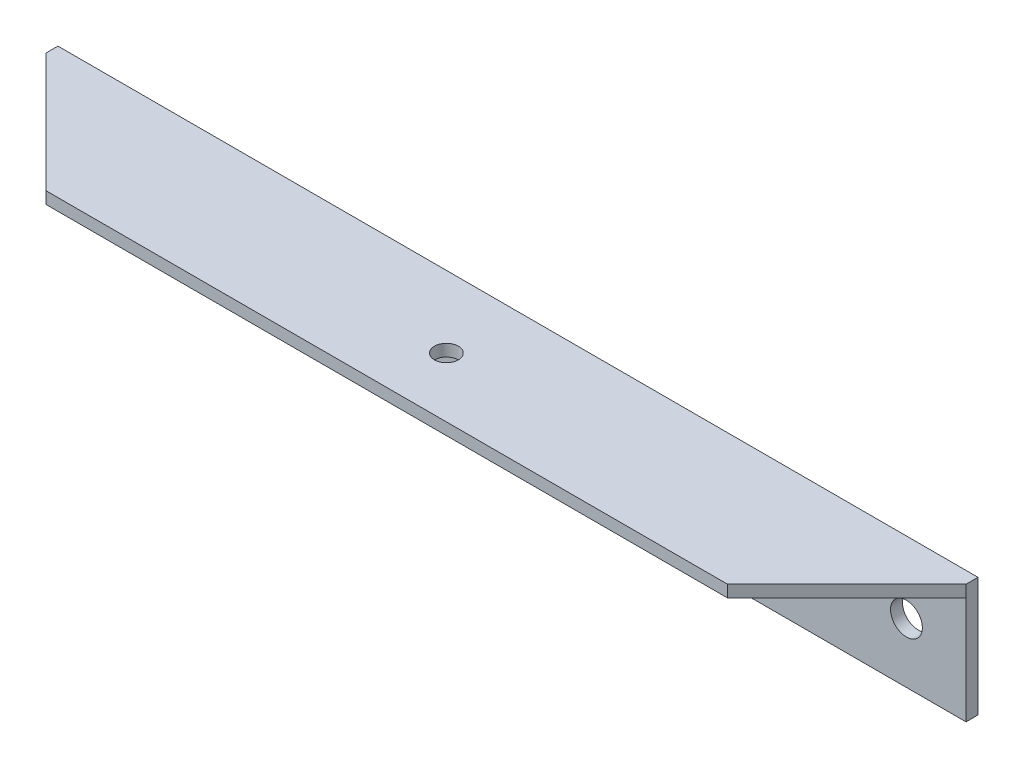
ISO-10303-21;
HEADER;
FILE_DESCRIPTION(('STEP AP214'),'2;1');
FILE_NAME('part.step','',(''),(''),'','','');
FILE_SCHEMA(('AUTOMOTIVE_DESIGN { 1 0 10303 214 1 1 1 1 }'));
ENDSEC;
DATA;
#1=APPLICATION_CONTEXT('core data for automotive mechanical design processes');
#2=APPLICATION_PROTOCOL_DEFINITION('international standard','automotive_design',2000,#1);
#3=PRODUCT_CONTEXT('',#1,'mechanical');
#4=PRODUCT('Part','Part','',(#3));
#5=PRODUCT_RELATED_PRODUCT_CATEGORY('part','',(#4));
#6=PRODUCT_DEFINITION_FORMATION('','',#4);
#7=PRODUCT_DEFINITION_CONTEXT('part definition',#1,'design');
#8=PRODUCT_DEFINITION('design','',#6,#7);
#9=PRODUCT_DEFINITION_SHAPE('','',#8);
#10=(LENGTH_UNIT() NAMED_UNIT(*) SI_UNIT(.MILLI.,.METRE.));
#11=(NAMED_UNIT(*) PLANE_ANGLE_UNIT() SI_UNIT($,.RADIAN.));
#12=(NAMED_UNIT(*) SI_UNIT($,.STERADIAN.) SOLID_ANGLE_UNIT());
#13=UNCERTAINTY_MEASURE_WITH_UNIT(LENGTH_MEASURE(1.E-05),#10,'distance_accuracy_value','');
#14=(GEOMETRIC_REPRESENTATION_CONTEXT(3) GLOBAL_UNCERTAINTY_ASSIGNED_CONTEXT((#13)) GLOBAL_UNIT_ASSIGNED_CONTEXT((#10,
#11,#12)) REPRESENTATION_CONTEXT('',''));
#15=CARTESIAN_POINT('',(0.,0.,0.));
#16=DIRECTION('',(0.,0.,1.));
#17=DIRECTION('',(1.,0.,0.));
#18=AXIS2_PLACEMENT_3D('',#15,#16,#17);
#19=CARTESIAN_POINT('',(115.7,0.,3.));
#20=DIRECTION('',(-1.,0.,0.));
#21=DIRECTION('',(0.,0.,1.));
#22=AXIS2_PLACEMENT_3D('',#19,#20,#21);
#23=PLANE('',#22);
#24=DIRECTION('',(0.,1.,0.));
#25=VECTOR('',#24,1.);
#26=CARTESIAN_POINT('',(115.7,0.,0.));
#27=LINE('',#26,#25);
#28=CARTESIAN_POINT('',(115.7,-30.,0.));
#29=VERTEX_POINT('',#28);
#30=CARTESIAN_POINT('',(115.7,0.,0.));
#31=VERTEX_POINT('',#30);
#32=EDGE_CURVE('E94',#29,#31,#27,.T.);
#33=ORIENTED_EDGE('',*,*,#32,.T.);
#34=DIRECTION('',(0.,0.,-1.));
#35=VECTOR('',#34,1.);
#36=CARTESIAN_POINT('',(115.7,0.,3.));
#37=LINE('',#36,#35);
#38=CARTESIAN_POINT('',(115.7,0.,3.));
#39=VERTEX_POINT('',#38);
#40=EDGE_CURVE('E11',#39,#31,#37,.T.);
#41=ORIENTED_EDGE('',*,*,#40,.F.);
#42=DIRECTION('',(0.,1.,0.));
#43=VECTOR('',#42,1.);
#44=CARTESIAN_POINT('',(115.7,-2.99999999999998,3.));
#45=LINE('',#44,#43);
#46=CARTESIAN_POINT('',(115.7,-2.99999999999998,3.));
#47=VERTEX_POINT('',#46);
#48=EDGE_CURVE('E99',#47,#39,#45,.T.);
#49=ORIENTED_EDGE('',*,*,#48,.F.);
#50=DIRECTION('',(0.,1.,0.));
#51=VECTOR('',#50,1.);
#52=CARTESIAN_POINT('',(115.7,0.,3.));
#53=LINE('',#52,#51);
#54=CARTESIAN_POINT('',(115.7,-30.,3.));
#55=VERTEX_POINT('',#54);
#56=EDGE_CURVE('E88',#55,#47,#53,.T.);
#57=ORIENTED_EDGE('',*,*,#56,.F.);
#58=DIRECTION('',(0.,0.,-1.));
#59=VECTOR('',#58,1.);
#60=CARTESIAN_POINT('',(115.7,-30.,3.));
#61=LINE('',#60,#59);
#62=EDGE_CURVE('E81',#55,#29,#61,.T.);
#63=ORIENTED_EDGE('',*,*,#62,.T.);
#64=EDGE_LOOP('',(#33,#41,#49,#57,#63));
#65=FACE_BOUND('',#64,.T.);
#66=ADVANCED_FACE('F35',(#65),#23,.F.);
#67=CARTESIAN_POINT('',(-115.7,0.,3.));
#68=DIRECTION('',(0.,-1.,0.));
#69=DIRECTION('',(1.,0.,0.));
#70=AXIS2_PLACEMENT_3D('',#67,#68,#69);
#71=PLANE('',#70);
#72=CARTESIAN_POINT('',(0.,0.,17.9999999999998));
#73=DIRECTION('',(0.,1.,0.));
#74=DIRECTION('',(0.,0.,1.));
#75=AXIS2_PLACEMENT_3D('',#72,#73,#74);
#76=CIRCLE('',#75,3.);
#77=CARTESIAN_POINT('',(0.,0.,20.9999999999998));
#78=VERTEX_POINT('',#77);
#79=EDGE_CURVE('E199',#78,#78,#76,.T.);
#80=ORIENTED_EDGE('',*,*,#79,.F.);
#81=EDGE_LOOP('',(#80));
#82=FACE_BOUND('',#81,.T.);
#83=DIRECTION('',(-1.,0.,0.));
#84=VECTOR('',#83,1.);
#85=CARTESIAN_POINT('',(-115.7,0.,0.));
#86=LINE('',#85,#84);
#87=CARTESIAN_POINT('',(-115.7,0.,0.));
#88=VERTEX_POINT('',#87);
#89=EDGE_CURVE('E98',#31,#88,#86,.T.);
#90=ORIENTED_EDGE('',*,*,#89,.T.);
#91=DIRECTION('',(0.,0.,-1.));
#92=VECTOR('',#91,1.);
#93=CARTESIAN_POINT('',(-115.7,0.,3.));
#94=LINE('',#93,#92);
#95=CARTESIAN_POINT('',(-115.7,0.,3.));
#96=VERTEX_POINT('',#95);
#97=EDGE_CURVE('E43',#96,#88,#94,.T.);
#98=ORIENTED_EDGE('',*,*,#97,.F.);
#99=DIRECTION('',(0.707106781186549,0.,0.707106781186546));
#100=VECTOR('',#99,1.);
#101=CARTESIAN_POINT('',(-115.7,0.,3.));
#102=LINE('',#101,#100);
#103=CARTESIAN_POINT('',(-85.7000000000001,0.,32.9999999999998));
#104=VERTEX_POINT('',#103);
#105=EDGE_CURVE('E124',#96,#104,#102,.T.);
#106=ORIENTED_EDGE('',*,*,#105,.T.);
#107=DIRECTION('',(1.,0.,0.));
#108=VECTOR('',#107,1.);
#109=CARTESIAN_POINT('',(-85.7000000000001,0.,32.9999999999998));
#110=LINE('',#109,#108);
#111=CARTESIAN_POINT('',(85.6999999999998,0.,32.9999999999998));
#112=VERTEX_POINT('',#111);
#113=EDGE_CURVE('E165',#104,#112,#110,.T.);
#114=ORIENTED_EDGE('',*,*,#113,.T.);
#115=DIRECTION('',(0.707106781186552,0.,-0.707106781186543));
#116=VECTOR('',#115,1.);
#117=CARTESIAN_POINT('',(115.7,0.,3.));
#118=LINE('',#117,#116);
#119=EDGE_CURVE('E147',#112,#39,#118,.T.);
#120=ORIENTED_EDGE('',*,*,#119,.T.);
#121=ORIENTED_EDGE('',*,*,#40,.T.);
#122=EDGE_LOOP('',(#90,#98,#106,#114,#120,#121));
#123=FACE_BOUND('',#122,.T.);
#124=ADVANCED_FACE('F120',(#82,#123),#71,.F.);
#125=CARTESIAN_POINT('',(-115.7,-30.,3.));
#126=DIRECTION('',(1.,0.,0.));
#127=DIRECTION('',(0.,0.,-1.));
#128=AXIS2_PLACEMENT_3D('',#125,#126,#127);
#129=PLANE('',#128);
#130=DIRECTION('',(0.,-1.,0.));
#131=VECTOR('',#130,1.);
#132=CARTESIAN_POINT('',(-115.7,-30.,0.));
#133=LINE('',#132,#131);
#134=CARTESIAN_POINT('',(-115.7,-30.,0.));
#135=VERTEX_POINT('',#134);
#136=EDGE_CURVE('E89',#88,#135,#133,.T.);
#137=ORIENTED_EDGE('',*,*,#136,.T.);
#138=DIRECTION('',(0.,0.,-1.));
#139=VECTOR('',#138,1.);
#140=CARTESIAN_POINT('',(-115.7,-30.,3.));
#141=LINE('',#140,#139);
#142=CARTESIAN_POINT('',(-115.7,-30.,3.));
#143=VERTEX_POINT('',#142);
#144=EDGE_CURVE('E84',#143,#135,#141,.T.);
#145=ORIENTED_EDGE('',*,*,#144,.F.);
#146=DIRECTION('',(0.,-1.,0.));
#147=VECTOR('',#146,1.);
#148=CARTESIAN_POINT('',(-115.7,-30.,3.));
#149=LINE('',#148,#147);
#150=CARTESIAN_POINT('',(-115.7,-3.00000000000001,3.));
#151=VERTEX_POINT('',#150);
#152=EDGE_CURVE('E169',#151,#143,#149,.T.);
#153=ORIENTED_EDGE('',*,*,#152,.F.);
#154=EDGE_CURVE('E117',#96,#151,#149,.T.);
#155=ORIENTED_EDGE('',*,*,#154,.F.);
#156=ORIENTED_EDGE('',*,*,#97,.T.);
#157=EDGE_LOOP('',(#137,#145,#153,#155,#156));
#158=FACE_BOUND('',#157,.T.);
#159=ADVANCED_FACE('F114',(#158),#129,.F.);
#160=CARTESIAN_POINT('',(115.7,-30.,3.));
#161=DIRECTION('',(0.,1.,0.));
#162=DIRECTION('',(0.,0.,1.));
#163=AXIS2_PLACEMENT_3D('',#160,#161,#162);
#164=PLANE('',#163);
#165=DIRECTION('',(1.,0.,0.));
#166=VECTOR('',#165,1.);
#167=CARTESIAN_POINT('',(115.7,-30.,0.));
#168=LINE('',#167,#166);
#169=EDGE_CURVE('E78',#135,#29,#168,.T.);
#170=ORIENTED_EDGE('',*,*,#169,.T.);
#171=ORIENTED_EDGE('',*,*,#62,.F.);
#172=DIRECTION('',(1.,0.,0.));
#173=VECTOR('',#172,1.);
#174=CARTESIAN_POINT('',(115.7,-30.,3.));
#175=LINE('',#174,#173);
#176=EDGE_CURVE('E59',#143,#55,#175,.T.);
#177=ORIENTED_EDGE('',*,*,#176,.F.);
#178=ORIENTED_EDGE('',*,*,#144,.T.);
#179=EDGE_LOOP('',(#170,#171,#177,#178));
#180=FACE_BOUND('',#179,.T.);
#181=ADVANCED_FACE('F80',(#180),#164,.F.);
#182=CARTESIAN_POINT('',(0.,0.,3.));
#183=DIRECTION('',(0.,0.,-1.));
#184=DIRECTION('',(-1.,0.,0.));
#185=AXIS2_PLACEMENT_3D('',#182,#183,#184);
#186=PLANE('',#185);
#187=CARTESIAN_POINT('',(-62.5,-15.,3.));
#188=DIRECTION('',(0.,0.,-1.));
#189=DIRECTION('',(-1.,0.,0.));
#190=AXIS2_PLACEMENT_3D('',#187,#188,#189);
#191=CIRCLE('',#190,4.99999999999999);
#192=CARTESIAN_POINT('',(-67.5,-15.,3.));
#193=VERTEX_POINT('',#192);
#194=EDGE_CURVE('E209',#193,#193,#191,.T.);
#195=ORIENTED_EDGE('',*,*,#194,.T.);
#196=EDGE_LOOP('',(#195));
#197=FACE_BOUND('',#196,.T.);
#198=CARTESIAN_POINT('',(100.7,-15.,3.));
#199=DIRECTION('',(0.,0.,-1.));
#200=DIRECTION('',(-1.,0.,0.));
#201=AXIS2_PLACEMENT_3D('',#198,#199,#200);
#202=CIRCLE('',#201,3.99999999999999);
#203=CARTESIAN_POINT('',(96.7,-15.,3.));
#204=VERTEX_POINT('',#203);
#205=EDGE_CURVE('E214',#204,#204,#202,.T.);
#206=ORIENTED_EDGE('',*,*,#205,.T.);
#207=EDGE_LOOP('',(#206));
#208=FACE_BOUND('',#207,.T.);
#209=CARTESIAN_POINT('',(-100.7,-15.,3.));
#210=DIRECTION('',(0.,0.,-1.));
#211=DIRECTION('',(-1.,0.,0.));
#212=AXIS2_PLACEMENT_3D('',#209,#210,#211);
#213=CIRCLE('',#212,3.99999999999999);
#214=CARTESIAN_POINT('',(-104.7,-15.,3.));
#215=VERTEX_POINT('',#214);
#216=EDGE_CURVE('E38',#215,#215,#213,.T.);
#217=ORIENTED_EDGE('',*,*,#216,.T.);
#218=EDGE_LOOP('',(#217));
#219=FACE_BOUND('',#218,.T.);
#220=ORIENTED_EDGE('',*,*,#56,.T.);
#221=DIRECTION('',(-1.,0.,0.));
#222=VECTOR('',#221,1.);
#223=CARTESIAN_POINT('',(-115.7,-3.00000000000002,3.));
#224=LINE('',#223,#222);
#225=EDGE_CURVE('E156',#47,#151,#224,.T.);
#226=ORIENTED_EDGE('',*,*,#225,.T.);
#227=ORIENTED_EDGE('',*,*,#152,.T.);
#228=ORIENTED_EDGE('',*,*,#176,.T.);
#229=EDGE_LOOP('',(#220,#226,#227,#228));
#230=FACE_BOUND('',#229,.T.);
#231=ADVANCED_FACE('F170',(#197,#208,#219,#230),#186,.F.);
#232=CARTESIAN_POINT('',(0.,0.,0.));
#233=DIRECTION('',(0.,0.,-1.));
#234=DIRECTION('',(-1.,0.,0.));
#235=AXIS2_PLACEMENT_3D('',#232,#233,#234);
#236=PLANE('',#235);
#237=CARTESIAN_POINT('',(-62.5,-15.,0.));
#238=DIRECTION('',(0.,0.,-1.));
#239=DIRECTION('',(-1.,0.,0.));
#240=AXIS2_PLACEMENT_3D('',#237,#238,#239);
#241=CIRCLE('',#240,5.);
#242=CARTESIAN_POINT('',(-67.5,-15.,0.));
#243=VERTEX_POINT('',#242);
#244=EDGE_CURVE('E204',#243,#243,#241,.T.);
#245=ORIENTED_EDGE('',*,*,#244,.F.);
#246=EDGE_LOOP('',(#245));
#247=FACE_BOUND('',#246,.T.);
#248=CARTESIAN_POINT('',(100.7,-15.,0.));
#249=DIRECTION('',(0.,0.,-1.));
#250=DIRECTION('',(-1.,0.,0.));
#251=AXIS2_PLACEMENT_3D('',#248,#249,#250);
#252=CIRCLE('',#251,3.99999999999999);
#253=CARTESIAN_POINT('',(96.7,-15.,0.));
#254=VERTEX_POINT('',#253);
#255=EDGE_CURVE('E211',#254,#254,#252,.T.);
#256=ORIENTED_EDGE('',*,*,#255,.F.);
#257=EDGE_LOOP('',(#256));
#258=FACE_BOUND('',#257,.T.);
#259=CARTESIAN_POINT('',(-100.7,-15.,0.));
#260=DIRECTION('',(0.,0.,-1.));
#261=DIRECTION('',(-1.,0.,0.));
#262=AXIS2_PLACEMENT_3D('',#259,#260,#261);
#263=CIRCLE('',#262,3.99999999999999);
#264=CARTESIAN_POINT('',(-104.7,-15.,0.));
#265=VERTEX_POINT('',#264);
#266=EDGE_CURVE('E216',#265,#265,#263,.T.);
#267=ORIENTED_EDGE('',*,*,#266,.F.);
#268=EDGE_LOOP('',(#267));
#269=FACE_BOUND('',#268,.T.);
#270=ORIENTED_EDGE('',*,*,#32,.F.);
#271=ORIENTED_EDGE('',*,*,#169,.F.);
#272=ORIENTED_EDGE('',*,*,#136,.F.);
#273=ORIENTED_EDGE('',*,*,#89,.F.);
#274=EDGE_LOOP('',(#270,#271,#272,#273));
#275=FACE_BOUND('',#274,.T.);
#276=ADVANCED_FACE('F97',(#247,#258,#269,#275),#236,.T.);
#277=CARTESIAN_POINT('',(-115.7,-3.00000000000002,3.));
#278=DIRECTION('',(-0.707106781186546,0.,0.707106781186549));
#279=DIRECTION('',(0.707106781186549,0.,0.707106781186546));
#280=AXIS2_PLACEMENT_3D('',#277,#278,#279);
#281=PLANE('',#280);
#282=ORIENTED_EDGE('',*,*,#105,.F.);
#283=ORIENTED_EDGE('',*,*,#154,.T.);
#284=DIRECTION('',(0.707106781186549,0.,0.707106781186546));
#285=VECTOR('',#284,1.);
#286=CARTESIAN_POINT('',(-115.7,-3.00000000000002,3.));
#287=LINE('',#286,#285);
#288=CARTESIAN_POINT('',(-85.7000000000001,-3.00000000000002,32.9999999999998));
#289=VERTEX_POINT('',#288);
#290=EDGE_CURVE('E50',#151,#289,#287,.T.);
#291=ORIENTED_EDGE('',*,*,#290,.T.);
#292=DIRECTION('',(0.,1.,0.));
#293=VECTOR('',#292,1.);
#294=CARTESIAN_POINT('',(-85.7000000000001,-3.00000000000002,32.9999999999998));
#295=LINE('',#294,#293);
#296=EDGE_CURVE('E151',#289,#104,#295,.T.);
#297=ORIENTED_EDGE('',*,*,#296,.T.);
#298=EDGE_LOOP('',(#282,#283,#291,#297));
#299=FACE_BOUND('',#298,.T.);
#300=ADVANCED_FACE('F178',(#299),#281,.T.);
#301=CARTESIAN_POINT('',(115.7,-2.99999999999998,3.));
#302=DIRECTION('',(0.707106781186543,0.,0.707106781186552));
#303=DIRECTION('',(0.707106781186552,0.,-0.707106781186543));
#304=AXIS2_PLACEMENT_3D('',#301,#302,#303);
#305=PLANE('',#304);
#306=ORIENTED_EDGE('',*,*,#119,.F.);
#307=DIRECTION('',(0.,1.,0.));
#308=VECTOR('',#307,1.);
#309=CARTESIAN_POINT('',(85.6999999999998,-2.99999999999998,32.9999999999998));
#310=LINE('',#309,#308);
#311=CARTESIAN_POINT('',(85.6999999999998,-2.99999999999998,32.9999999999998));
#312=VERTEX_POINT('',#311);
#313=EDGE_CURVE('E103',#312,#112,#310,.T.);
#314=ORIENTED_EDGE('',*,*,#313,.F.);
#315=DIRECTION('',(0.707106781186552,0.,-0.707106781186543));
#316=VECTOR('',#315,1.);
#317=CARTESIAN_POINT('',(115.7,-2.99999999999998,3.));
#318=LINE('',#317,#316);
#319=EDGE_CURVE('E145',#312,#47,#318,.T.);
#320=ORIENTED_EDGE('',*,*,#319,.T.);
#321=ORIENTED_EDGE('',*,*,#48,.T.);
#322=EDGE_LOOP('',(#306,#314,#320,#321));
#323=FACE_BOUND('',#322,.T.);
#324=ADVANCED_FACE('F144',(#323),#305,.T.);
#325=CARTESIAN_POINT('',(-85.7000000000001,-3.00000000000002,32.9999999999998));
#326=DIRECTION('',(0.,0.,1.));
#327=DIRECTION('',(1.,0.,0.));
#328=AXIS2_PLACEMENT_3D('',#325,#326,#327);
#329=PLANE('',#328);
#330=ORIENTED_EDGE('',*,*,#113,.F.);
#331=ORIENTED_EDGE('',*,*,#296,.F.);
#332=DIRECTION('',(1.,0.,0.));
#333=VECTOR('',#332,1.);
#334=CARTESIAN_POINT('',(-85.7000000000001,-3.00000000000002,32.9999999999998));
#335=LINE('',#334,#333);
#336=EDGE_CURVE('E154',#289,#312,#335,.T.);
#337=ORIENTED_EDGE('',*,*,#336,.T.);
#338=ORIENTED_EDGE('',*,*,#313,.T.);
#339=EDGE_LOOP('',(#330,#331,#337,#338));
#340=FACE_BOUND('',#339,.T.);
#341=ADVANCED_FACE('F158',(#340),#329,.T.);
#342=CARTESIAN_POINT('',(0.,-3.,0.));
#343=DIRECTION('',(0.,-1.,0.));
#344=DIRECTION('',(1.,0.,0.));
#345=AXIS2_PLACEMENT_3D('',#342,#343,#344);
#346=PLANE('',#345);
#347=CARTESIAN_POINT('',(0.,-3.,17.9999999999998));
#348=DIRECTION('',(0.,-1.,0.));
#349=DIRECTION('',(1.,0.,0.));
#350=AXIS2_PLACEMENT_3D('',#347,#348,#349);
#351=CIRCLE('',#350,2.99999999999999);
#352=CARTESIAN_POINT('',(2.99999999999999,-3.,17.9999999999998));
#353=VERTEX_POINT('',#352);
#354=EDGE_CURVE('E201',#353,#353,#351,.T.);
#355=ORIENTED_EDGE('',*,*,#354,.F.);
#356=EDGE_LOOP('',(#355));
#357=FACE_BOUND('',#356,.T.);
#358=ORIENTED_EDGE('',*,*,#290,.F.);
#359=ORIENTED_EDGE('',*,*,#225,.F.);
#360=ORIENTED_EDGE('',*,*,#319,.F.);
#361=ORIENTED_EDGE('',*,*,#336,.F.);
#362=EDGE_LOOP('',(#358,#359,#360,#361));
#363=FACE_BOUND('',#362,.T.);
#364=ADVANCED_FACE('F153',(#357,#363),#346,.T.);
#365=CARTESIAN_POINT('',(-100.7,-15.,0.));
#366=DIRECTION('',(0.,0.,-1.));
#367=DIRECTION('',(-1.,0.,0.));
#368=AXIS2_PLACEMENT_3D('',#365,#366,#367);
#369=CYLINDRICAL_SURFACE('',#368,3.99999999999999);
#370=ORIENTED_EDGE('',*,*,#266,.T.);
#371=EDGE_LOOP('',(#370));
#372=FACE_BOUND('',#371,.T.);
#373=ORIENTED_EDGE('',*,*,#216,.F.);
#374=EDGE_LOOP('',(#373));
#375=FACE_BOUND('',#374,.T.);
#376=ADVANCED_FACE('F224',(#372,#375),#369,.F.);
#377=CARTESIAN_POINT('',(100.7,-15.,0.));
#378=DIRECTION('',(0.,0.,-1.));
#379=DIRECTION('',(-1.,0.,0.));
#380=AXIS2_PLACEMENT_3D('',#377,#378,#379);
#381=CYLINDRICAL_SURFACE('',#380,3.99999999999999);
#382=ORIENTED_EDGE('',*,*,#255,.T.);
#383=EDGE_LOOP('',(#382));
#384=FACE_BOUND('',#383,.T.);
#385=ORIENTED_EDGE('',*,*,#205,.F.);
#386=EDGE_LOOP('',(#385));
#387=FACE_BOUND('',#386,.T.);
#388=ADVANCED_FACE('F226',(#384,#387),#381,.F.);
#389=CARTESIAN_POINT('',(-62.5,-15.,0.));
#390=DIRECTION('',(0.,0.,-1.));
#391=DIRECTION('',(-1.,0.,0.));
#392=AXIS2_PLACEMENT_3D('',#389,#390,#391);
#393=CYLINDRICAL_SURFACE('',#392,4.99999999999999);
#394=ORIENTED_EDGE('',*,*,#244,.T.);
#395=EDGE_LOOP('',(#394));
#396=FACE_BOUND('',#395,.T.);
#397=ORIENTED_EDGE('',*,*,#194,.F.);
#398=EDGE_LOOP('',(#397));
#399=FACE_BOUND('',#398,.T.);
#400=ADVANCED_FACE('F232',(#396,#399),#393,.F.);
#401=CARTESIAN_POINT('',(0.,0.,17.9999999999998));
#402=DIRECTION('',(0.,1.,0.));
#403=DIRECTION('',(0.,0.,1.));
#404=AXIS2_PLACEMENT_3D('',#401,#402,#403);
#405=CYLINDRICAL_SURFACE('',#404,2.99999999999999);
#406=ORIENTED_EDGE('',*,*,#354,.T.);
#407=EDGE_LOOP('',(#406));
#408=FACE_BOUND('',#407,.T.);
#409=ORIENTED_EDGE('',*,*,#79,.T.);
#410=EDGE_LOOP('',(#409));
#411=FACE_BOUND('',#410,.T.);
#412=ADVANCED_FACE('F267',(#408,#411),#405,.F.);
#413=CLOSED_SHELL('',(#66,#124,#159,#181,#231,#276,#300,#324,#341,#364,#376,#388,#400,#412));
#414=MANIFOLD_SOLID_BREP('B2',#413);
#415=ADVANCED_BREP_SHAPE_REPRESENTATION('',(#18,#414),#14);
#416=SHAPE_DEFINITION_REPRESENTATION(#9,#415);
ENDSEC;
END-ISO-10303-21;
